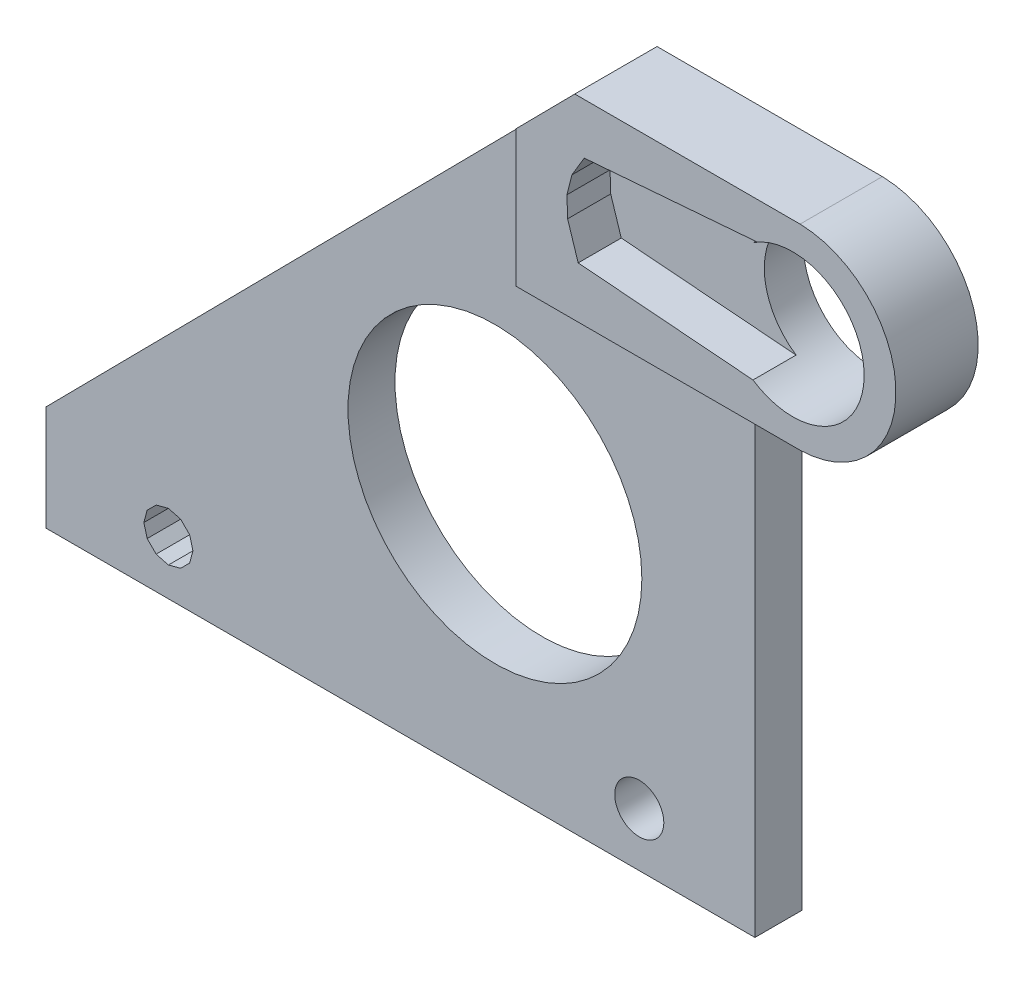
ISO-10303-21;
HEADER;
FILE_DESCRIPTION(('STEP AP214'),'2;1');
FILE_NAME('part.step','',(''),(''),'','','');
FILE_SCHEMA(('AUTOMOTIVE_DESIGN { 1 0 10303 214 1 1 1 1 }'));
ENDSEC;
DATA;
#1=APPLICATION_CONTEXT('core data for automotive mechanical design processes');
#2=APPLICATION_PROTOCOL_DEFINITION('international standard','automotive_design',2000,#1);
#3=PRODUCT_CONTEXT('',#1,'mechanical');
#4=PRODUCT('Part','Part','',(#3));
#5=PRODUCT_RELATED_PRODUCT_CATEGORY('part','',(#4));
#6=PRODUCT_DEFINITION_FORMATION('','',#4);
#7=PRODUCT_DEFINITION_CONTEXT('part definition',#1,'design');
#8=PRODUCT_DEFINITION('design','',#6,#7);
#9=PRODUCT_DEFINITION_SHAPE('','',#8);
#10=(LENGTH_UNIT() NAMED_UNIT(*) SI_UNIT(.MILLI.,.METRE.));
#11=(NAMED_UNIT(*) PLANE_ANGLE_UNIT() SI_UNIT($,.RADIAN.));
#12=(NAMED_UNIT(*) SI_UNIT($,.STERADIAN.) SOLID_ANGLE_UNIT());
#13=UNCERTAINTY_MEASURE_WITH_UNIT(LENGTH_MEASURE(1.E-05),#10,'distance_accuracy_value','');
#14=(GEOMETRIC_REPRESENTATION_CONTEXT(3) GLOBAL_UNCERTAINTY_ASSIGNED_CONTEXT((#13)) GLOBAL_UNIT_ASSIGNED_CONTEXT((#10,
#11,#12)) REPRESENTATION_CONTEXT('',''));
#15=CARTESIAN_POINT('',(0.,0.,0.));
#16=DIRECTION('',(0.,0.,1.));
#17=DIRECTION('',(1.,0.,0.));
#18=AXIS2_PLACEMENT_3D('',#15,#16,#17);
#19=CARTESIAN_POINT('',(0.,0.,2.40000011399388));
#20=DIRECTION('',(0.,0.,1.));
#21=DIRECTION('',(1.,0.,0.));
#22=AXIS2_PLACEMENT_3D('',#19,#20,#21);
#23=PLANE('',#22);
#24=DIRECTION('',(-0.966208690354707,0.257761065103018,0.));
#25=VECTOR('',#24,1.);
#26=CARTESIAN_POINT('',(-3.98662066640118,-14.9437135957094,2.40000011399388));
#27=LINE('',#26,#25);
#28=CARTESIAN_POINT('',(38.0759984254837,-26.1650010943413,2.40000011399388));
#29=VERTEX_POINT('',#28);
#30=CARTESIAN_POINT('',(37.4500006437302,-25.9980000555515,2.40000011399388));
#31=VERTEX_POINT('',#30);
#32=EDGE_CURVE('E359',#29,#31,#27,.T.);
#33=ORIENTED_EDGE('',*,*,#32,.F.);
#34=DIRECTION('',(-0.70710821592403,0.707105346446154,0.));
#35=VECTOR('',#34,1.);
#36=CARTESIAN_POINT('',(5.95542140844002,5.95544557591387,2.40000011399388));
#37=LINE('',#36,#35);
#38=CARTESIAN_POINT('',(38.5349988937378,-26.6239996999502,2.40000011399388));
#39=VERTEX_POINT('',#38);
#40=EDGE_CURVE('E299',#39,#29,#37,.T.);
#41=ORIENTED_EDGE('',*,*,#40,.F.);
#42=DIRECTION('',(-0.25919807048093,0.965824187033522,0.));
#43=VECTOR('',#42,1.);
#44=CARTESIAN_POINT('',(29.28103156368,7.85814539011296,2.40000011399388));
#45=LINE('',#44,#43);
#46=CARTESIAN_POINT('',(38.7029983103275,-27.2499993443489,2.40000011399388));
#47=VERTEX_POINT('',#46);
#48=EDGE_CURVE('E239',#47,#39,#45,.T.);
#49=ORIENTED_EDGE('',*,*,#48,.F.);
#50=DIRECTION('',(0.25919807048093,0.965824187033522,0.));
#51=VECTOR('',#50,1.);
#52=CARTESIAN_POINT('',(42.924548466217,-11.5196536679014,2.40000011399388));
#53=LINE('',#52,#51);
#54=CARTESIAN_POINT('',(38.5349988937378,-27.8759989887476,2.40000011399388));
#55=VERTEX_POINT('',#54);
#56=EDGE_CURVE('E332',#55,#47,#53,.T.);
#57=ORIENTED_EDGE('',*,*,#56,.F.);
#58=DIRECTION('',(0.707106781186548,0.707106781186548,0.));
#59=VECTOR('',#58,1.);
#60=CARTESIAN_POINT('',(33.2054989412427,-33.2054989412427,2.40000011399388));
#61=LINE('',#60,#59);
#62=CARTESIAN_POINT('',(38.0759984254837,-28.3349994570017,2.40000011399388));
#63=VERTEX_POINT('',#62);
#64=EDGE_CURVE('E335',#63,#55,#61,.T.);
#65=ORIENTED_EDGE('',*,*,#64,.F.);
#66=DIRECTION('',(0.965823274532014,0.259201470621325,0.));
#67=VECTOR('',#66,1.);
#68=CARTESIAN_POINT('',(9.65161474873277,-35.9633536754156,2.40000011399388));
#69=LINE('',#68,#67);
#70=CARTESIAN_POINT('',(37.4500006437302,-28.5030007362366,2.40000011399388));
#71=VERTEX_POINT('',#70);
#72=EDGE_CURVE('E338',#71,#63,#69,.T.);
#73=ORIENTED_EDGE('',*,*,#72,.F.);
#74=DIRECTION('',(0.965823274532014,-0.259201470621325,0.));
#75=VECTOR('',#74,1.);
#76=CARTESIAN_POINT('',(-4.61942802455213,-17.2126766504959,2.40000011399388));
#77=LINE('',#76,#75);
#78=CARTESIAN_POINT('',(36.8240028619766,-28.3349994570017,2.40000011399388));
#79=VERTEX_POINT('',#78);
#80=EDGE_CURVE('E341',#79,#71,#77,.T.);
#81=ORIENTED_EDGE('',*,*,#80,.F.);
#82=DIRECTION('',(0.707106781186548,-0.707106781186548,0.));
#83=VECTOR('',#82,1.);
#84=CARTESIAN_POINT('',(4.24450170248747,4.24450170248747,2.40000011399388));
#85=LINE('',#84,#83);
#86=CARTESIAN_POINT('',(36.3650023937225,-27.8759989887476,2.40000011399388));
#87=VERTEX_POINT('',#86);
#88=EDGE_CURVE('E344',#87,#79,#85,.T.);
#89=ORIENTED_EDGE('',*,*,#88,.F.);
#90=DIRECTION('',(0.257760349099157,-0.966208881366902,0.));
#91=VECTOR('',#90,1.);
#92=CARTESIAN_POINT('',(27.0063701911797,7.20462370262167,2.40000011399388));
#93=LINE('',#92,#91);
#94=CARTESIAN_POINT('',(36.1980013549328,-27.2499993443489,2.40000011399388));
#95=VERTEX_POINT('',#94);
#96=EDGE_CURVE('E347',#95,#87,#93,.T.);
#97=ORIENTED_EDGE('',*,*,#96,.F.);
#98=DIRECTION('',(-0.257760349099157,-0.966208881366902,0.));
#99=VECTOR('',#98,1.);
#100=CARTESIAN_POINT('',(40.5796133163287,-10.8256252829389,2.40000011399388));
#101=LINE('',#100,#99);
#102=CARTESIAN_POINT('',(36.3650023937225,-26.6239996999502,2.40000011399388));
#103=VERTEX_POINT('',#102);
#104=EDGE_CURVE('E350',#103,#95,#101,.T.);
#105=ORIENTED_EDGE('',*,*,#104,.F.);
#106=DIRECTION('',(-0.70710821592403,-0.707105346446154,0.));
#107=VECTOR('',#106,1.);
#108=CARTESIAN_POINT('',(31.4944272611455,-31.4945550675079,2.40000011399388));
#109=LINE('',#108,#107);
#110=CARTESIAN_POINT('',(36.8240028619766,-26.1650010943413,2.40000011399388));
#111=VERTEX_POINT('',#110);
#112=EDGE_CURVE('E353',#111,#103,#109,.T.);
#113=ORIENTED_EDGE('',*,*,#112,.F.);
#114=DIRECTION('',(-0.966208690354707,-0.257761065103018,0.));
#115=VECTOR('',#114,1.);
#116=CARTESIAN_POINT('',(8.9630341765009,-33.5976324035605,2.40000011399388));
#117=LINE('',#116,#115);
#118=EDGE_CURVE('E356',#31,#111,#117,.T.);
#119=ORIENTED_EDGE('',*,*,#118,.F.);
#120=EDGE_LOOP('',(#33,#41,#49,#57,#65,#73,#81,#89,#97,#105,#113,#119));
#121=FACE_BOUND('',#120,.T.);
#122=CARTESIAN_POINT('',(61.4942992281784,-27.2510253985397,2.40000011399388));
#123=DIRECTION('',(0.,0.,1.));
#124=DIRECTION('',(1.,0.,0.));
#125=AXIS2_PLACEMENT_3D('',#122,#123,#124);
#126=CIRCLE('',#125,1.2527587925465);
#127=CARTESIAN_POINT('',(62.7470580207249,-27.2510253985397,2.40000011399388));
#128=VERTEX_POINT('',#127);
#129=EDGE_CURVE('E362',#128,#128,#126,.T.);
#130=ORIENTED_EDGE('',*,*,#129,.F.);
#131=EDGE_LOOP('',(#130));
#132=FACE_BOUND('',#131,.T.);
#133=CARTESIAN_POINT('',(54.1229288053763,-17.0282926595011,2.40000011399388));
#134=DIRECTION('',(0.,0.,1.));
#135=DIRECTION('',(1.,0.,0.));
#136=AXIS2_PLACEMENT_3D('',#133,#134,#135);
#137=CIRCLE('',#136,7.50265038955251);
#138=CARTESIAN_POINT('',(61.6255791949288,-17.0282926595011,2.40000011399388));
#139=VERTEX_POINT('',#138);
#140=EDGE_CURVE('E367',#139,#139,#137,.T.);
#141=ORIENTED_EDGE('',*,*,#140,.F.);
#142=EDGE_LOOP('',(#141));
#143=FACE_BOUND('',#142,.T.);
#144=DIRECTION('',(-0.703007968621737,-0.711181971125772,0.));
#145=VECTOR('',#144,1.);
#146=CARTESIAN_POINT('',(46.9241922356063,-8.72940394256119,2.40000011399388));
#147=LINE('',#146,#145);
#148=CARTESIAN_POINT('',(46.9241922356063,-8.72940394256119,2.40000011399388));
#149=VERTEX_POINT('',#148);
#150=CARTESIAN_POINT('',(31.2000010162592,-24.63642321527,2.40000011399388));
#151=VERTEX_POINT('',#150);
#152=EDGE_CURVE('E434',#149,#151,#147,.T.);
#153=ORIENTED_EDGE('',*,*,#152,.T.);
#154=DIRECTION('',(0.,1.,0.));
#155=VECTOR('',#154,1.);
#156=CARTESIAN_POINT('',(31.2000010162592,-29.9999993294477,2.40000011399388));
#157=LINE('',#156,#155);
#158=CARTESIAN_POINT('',(31.2000010162592,-29.9999993294477,2.40000011399388));
#159=VERTEX_POINT('',#158);
#160=EDGE_CURVE('E392',#159,#151,#157,.T.);
#161=ORIENTED_EDGE('',*,*,#160,.F.);
#162=DIRECTION('',(-1.,0.,0.));
#163=VECTOR('',#162,1.);
#164=CARTESIAN_POINT('',(31.2000010162592,-29.9999993294477,2.40000011399388));
#165=LINE('',#164,#163);
#166=CARTESIAN_POINT('',(67.4000009894371,-29.9999993294477,2.40000011399388));
#167=VERTEX_POINT('',#166);
#168=EDGE_CURVE('E390',#167,#159,#165,.T.);
#169=ORIENTED_EDGE('',*,*,#168,.F.);
#170=DIRECTION('',(0.,-1.,0.));
#171=VECTOR('',#170,1.);
#172=CARTESIAN_POINT('',(67.4000021519565,-5.49999997019768,2.40000011399388));
#173=LINE('',#172,#171);
#174=CARTESIAN_POINT('',(67.4000021519565,-5.49999997019768,2.40000011399388));
#175=VERTEX_POINT('',#174);
#176=EDGE_CURVE('E401',#175,#167,#173,.T.);
#177=ORIENTED_EDGE('',*,*,#176,.F.);
#178=DIRECTION('',(-1.,0.,0.));
#179=VECTOR('',#178,1.);
#180=CARTESIAN_POINT('',(71.5056136250496,-5.49999997019768,2.40000011399388));
#181=LINE('',#180,#179);
#182=CARTESIAN_POINT('',(57.0000000298023,-5.49999997019768,2.40000011399388));
#183=VERTEX_POINT('',#182);
#184=EDGE_CURVE('E412',#175,#183,#181,.T.);
#185=ORIENTED_EDGE('',*,*,#184,.T.);
#186=DIRECTION('',(0.,1.,0.));
#187=VECTOR('',#186,1.);
#188=CARTESIAN_POINT('',(57.0000000298023,-7.40568592017014,2.40000011399388));
#189=LINE('',#188,#187);
#190=CARTESIAN_POINT('',(57.0000000298023,1.4635578263551,2.40000011399388));
#191=VERTEX_POINT('',#190);
#192=EDGE_CURVE('E422',#183,#191,#189,.T.);
#193=ORIENTED_EDGE('',*,*,#192,.T.);
#194=DIRECTION('',(-0.70300801596017,-0.711181924331422,0.));
#195=VECTOR('',#194,1.);
#196=CARTESIAN_POINT('',(57.0000000298023,1.4635578263551,2.40000011399388));
#197=LINE('',#196,#195);
#198=EDGE_CURVE('E425',#191,#149,#197,.T.);
#199=ORIENTED_EDGE('',*,*,#198,.T.);
#200=EDGE_LOOP('',(#153,#161,#169,#177,#185,#193,#199));
#201=FACE_BOUND('',#200,.T.);
#202=ADVANCED_FACE('F38',(#121,#132,#143,#201),#23,.T.);
#203=CARTESIAN_POINT('',(71.505614787569,4.49999865712685,0.));
#204=DIRECTION('',(0.,1.,0.));
#205=DIRECTION('',(-1.,0.,0.));
#206=AXIS2_PLACEMENT_3D('',#203,#204,#205);
#207=PLANE('',#206);
#208=DIRECTION('',(-1.,0.,0.));
#209=VECTOR('',#208,1.);
#210=CARTESIAN_POINT('',(71.505614787569,4.49999865712685,4.19999985024333));
#211=LINE('',#210,#209);
#212=CARTESIAN_POINT('',(71.505614787569,4.49999865712685,4.19999985024333));
#213=VERTEX_POINT('',#212);
#214=CARTESIAN_POINT('',(60.0015420915985,4.49999865712685,4.19999985024333));
#215=VERTEX_POINT('',#214);
#216=EDGE_CURVE('E513',#213,#215,#211,.T.);
#217=ORIENTED_EDGE('',*,*,#216,.F.);
#218=DIRECTION('',(0.,0.,1.));
#219=VECTOR('',#218,1.);
#220=CARTESIAN_POINT('',(71.505614787569,4.49999865712685,0.));
#221=LINE('',#220,#219);
#222=CARTESIAN_POINT('',(71.505614787569,4.49999865712685,0.));
#223=VERTEX_POINT('',#222);
#224=EDGE_CURVE('E541',#223,#213,#221,.T.);
#225=ORIENTED_EDGE('',*,*,#224,.F.);
#226=DIRECTION('',(-1.,0.,0.));
#227=VECTOR('',#226,1.);
#228=CARTESIAN_POINT('',(71.505614787569,4.49999865712685,0.));
#229=LINE('',#228,#227);
#230=CARTESIAN_POINT('',(60.0015420915985,4.49999865712685,0.));
#231=VERTEX_POINT('',#230);
#232=EDGE_CURVE('E517',#223,#231,#229,.T.);
#233=ORIENTED_EDGE('',*,*,#232,.T.);
#234=DIRECTION('',(0.,0.,1.));
#235=VECTOR('',#234,1.);
#236=CARTESIAN_POINT('',(60.0015420915985,4.49999865712685,0.));
#237=LINE('',#236,#235);
#238=EDGE_CURVE('E530',#231,#215,#237,.T.);
#239=ORIENTED_EDGE('',*,*,#238,.T.);
#240=EDGE_LOOP('',(#217,#225,#233,#239));
#241=FACE_BOUND('',#240,.T.);
#242=ADVANCED_FACE('F40',(#241),#207,.T.);
#243=CARTESIAN_POINT('',(71.3988662053926,-0.500001231114437,0.));
#244=DIRECTION('',(0.,0.,1.));
#245=DIRECTION('',(1.,0.,0.));
#246=AXIS2_PLACEMENT_3D('',#243,#244,#245);
#247=CYLINDRICAL_SURFACE('',#246,5.00113928442406);
#248=CARTESIAN_POINT('',(71.3988662053926,-0.500001231114437,4.19999985024333));
#249=DIRECTION('',(0.,0.,1.));
#250=DIRECTION('',(-1.,0.,0.));
#251=AXIS2_PLACEMENT_3D('',#248,#249,#250);
#252=CIRCLE('',#251,5.00113928442406);
#253=CARTESIAN_POINT('',(71.5056136250496,-5.49999997019768,4.19999985024333));
#254=VERTEX_POINT('',#253);
#255=EDGE_CURVE('E522',#254,#213,#252,.T.);
#256=ORIENTED_EDGE('',*,*,#255,.F.);
#257=DIRECTION('',(0.,0.,1.));
#258=VECTOR('',#257,1.);
#259=CARTESIAN_POINT('',(71.505614787569,-5.50000111935573,0.));
#260=LINE('',#259,#258);
#261=CARTESIAN_POINT('',(71.505614787569,-5.49999997019768,0.));
#262=VERTEX_POINT('',#261);
#263=EDGE_CURVE('E545',#262,#254,#260,.T.);
#264=ORIENTED_EDGE('',*,*,#263,.F.);
#265=CARTESIAN_POINT('',(71.3988662053926,-0.500001231114437,0.));
#266=DIRECTION('',(0.,0.,1.));
#267=DIRECTION('',(-1.,0.,0.));
#268=AXIS2_PLACEMENT_3D('',#265,#266,#267);
#269=CIRCLE('',#268,5.00113928442406);
#270=EDGE_CURVE('E526',#262,#223,#269,.T.);
#271=ORIENTED_EDGE('',*,*,#270,.T.);
#272=ORIENTED_EDGE('',*,*,#224,.T.);
#273=EDGE_LOOP('',(#256,#264,#271,#272));
#274=FACE_BOUND('',#273,.T.);
#275=ADVANCED_FACE('F613',(#274),#247,.T.);
#276=CARTESIAN_POINT('',(36.1980013549327,-19.5803102105856,0.));
#277=DIRECTION('',(-0.711181971125772,0.703007968621737,0.));
#278=DIRECTION('',(-0.703007968621737,-0.711181971125772,0.));
#279=AXIS2_PLACEMENT_3D('',#276,#277,#278);
#280=PLANE('',#279);
#281=DIRECTION('',(0.,0.,1.));
#282=VECTOR('',#281,1.);
#283=CARTESIAN_POINT('',(57.0000000298023,1.4635578263551,2.40000011399388));
#284=LINE('',#283,#282);
#285=CARTESIAN_POINT('',(57.0000000298023,1.4635578263551,4.19999985024333));
#286=VERTEX_POINT('',#285);
#287=EDGE_CURVE('E428',#191,#286,#284,.T.);
#288=ORIENTED_EDGE('',*,*,#287,.T.);
#289=DIRECTION('',(-0.703007968621737,-0.711181971125772,0.));
#290=VECTOR('',#289,1.);
#291=CARTESIAN_POINT('',(36.1980013549327,-19.5803102105856,4.19999985024333));
#292=LINE('',#291,#290);
#293=EDGE_CURVE('E534',#215,#286,#292,.T.);
#294=ORIENTED_EDGE('',*,*,#293,.F.);
#295=ORIENTED_EDGE('',*,*,#238,.F.);
#296=DIRECTION('',(-0.703007968621737,-0.711181971125772,0.));
#297=VECTOR('',#296,1.);
#298=CARTESIAN_POINT('',(60.0015420915985,4.49999865712685,0.));
#299=LINE('',#298,#297);
#300=CARTESIAN_POINT('',(31.2000010162592,-24.63642321527,0.));
#301=VERTEX_POINT('',#300);
#302=EDGE_CURVE('E521',#231,#301,#299,.T.);
#303=ORIENTED_EDGE('',*,*,#302,.T.);
#304=DIRECTION('',(0.,0.,1.));
#305=VECTOR('',#304,1.);
#306=CARTESIAN_POINT('',(31.2000010162592,-24.63642321527,0.));
#307=LINE('',#306,#305);
#308=EDGE_CURVE('E548',#301,#151,#307,.T.);
#309=ORIENTED_EDGE('',*,*,#308,.T.);
#310=ORIENTED_EDGE('',*,*,#152,.F.);
#311=ORIENTED_EDGE('',*,*,#198,.F.);
#312=EDGE_LOOP('',(#288,#294,#295,#303,#309,#310,#311));
#313=FACE_BOUND('',#312,.T.);
#314=ADVANCED_FACE('F638',(#313),#280,.T.);
#315=CARTESIAN_POINT('',(71.3988662053926,-0.500001231114437,0.));
#316=DIRECTION('',(0.,0.,-1.));
#317=DIRECTION('',(-1.,0.,0.));
#318=AXIS2_PLACEMENT_3D('',#315,#316,#317);
#319=PLANE('',#318);
#320=DIRECTION('',(0.966208690354707,-0.257761065103018,0.));
#321=VECTOR('',#320,1.);
#322=CARTESIAN_POINT('',(37.4500006437302,-25.9980000555515,0.));
#323=LINE('',#322,#321);
#324=CARTESIAN_POINT('',(37.4500006437302,-25.9980000555515,0.));
#325=VERTEX_POINT('',#324);
#326=CARTESIAN_POINT('',(38.0759984254837,-26.1650010943413,0.));
#327=VERTEX_POINT('',#326);
#328=EDGE_CURVE('E62',#325,#327,#323,.T.);
#329=ORIENTED_EDGE('',*,*,#328,.F.);
#330=DIRECTION('',(0.966208690354707,0.257761065103018,0.));
#331=VECTOR('',#330,1.);
#332=CARTESIAN_POINT('',(36.8240028619766,-26.1650010943413,0.));
#333=LINE('',#332,#331);
#334=CARTESIAN_POINT('',(36.8240028619766,-26.1650010943413,0.));
#335=VERTEX_POINT('',#334);
#336=EDGE_CURVE('E292',#335,#325,#333,.T.);
#337=ORIENTED_EDGE('',*,*,#336,.F.);
#338=DIRECTION('',(0.70710821592403,0.707105346446154,0.));
#339=VECTOR('',#338,1.);
#340=CARTESIAN_POINT('',(36.3650023937225,-26.6239996999502,0.));
#341=LINE('',#340,#339);
#342=CARTESIAN_POINT('',(36.3650023937225,-26.6239996999502,0.));
#343=VERTEX_POINT('',#342);
#344=EDGE_CURVE('E288',#343,#335,#341,.T.);
#345=ORIENTED_EDGE('',*,*,#344,.F.);
#346=DIRECTION('',(0.257760349099157,0.966208881366902,0.));
#347=VECTOR('',#346,1.);
#348=CARTESIAN_POINT('',(36.1980013549328,-27.2499993443489,0.));
#349=LINE('',#348,#347);
#350=CARTESIAN_POINT('',(36.1980013549328,-27.2499993443489,0.));
#351=VERTEX_POINT('',#350);
#352=EDGE_CURVE('E284',#351,#343,#349,.T.);
#353=ORIENTED_EDGE('',*,*,#352,.F.);
#354=DIRECTION('',(-0.257760349099157,0.966208881366902,0.));
#355=VECTOR('',#354,1.);
#356=CARTESIAN_POINT('',(36.3650023937225,-27.8759989887476,0.));
#357=LINE('',#356,#355);
#358=CARTESIAN_POINT('',(36.3650023937225,-27.8759989887476,0.));
#359=VERTEX_POINT('',#358);
#360=EDGE_CURVE('E280',#359,#351,#357,.T.);
#361=ORIENTED_EDGE('',*,*,#360,.F.);
#362=DIRECTION('',(-0.707106781186547,0.707106781186547,0.));
#363=VECTOR('',#362,1.);
#364=CARTESIAN_POINT('',(36.8240028619766,-28.3349994570017,0.));
#365=LINE('',#364,#363);
#366=CARTESIAN_POINT('',(36.8240028619766,-28.3349994570017,0.));
#367=VERTEX_POINT('',#366);
#368=EDGE_CURVE('E276',#367,#359,#365,.T.);
#369=ORIENTED_EDGE('',*,*,#368,.F.);
#370=DIRECTION('',(-0.965823274532014,0.259201470621325,0.));
#371=VECTOR('',#370,1.);
#372=CARTESIAN_POINT('',(37.4500006437302,-28.5030007362366,0.));
#373=LINE('',#372,#371);
#374=CARTESIAN_POINT('',(37.4500006437302,-28.5030007362366,0.));
#375=VERTEX_POINT('',#374);
#376=EDGE_CURVE('E272',#375,#367,#373,.T.);
#377=ORIENTED_EDGE('',*,*,#376,.F.);
#378=DIRECTION('',(-0.965823274532014,-0.259201470621325,0.));
#379=VECTOR('',#378,1.);
#380=CARTESIAN_POINT('',(38.0759984254837,-28.3349994570017,0.));
#381=LINE('',#380,#379);
#382=CARTESIAN_POINT('',(38.0759984254837,-28.3349994570017,0.));
#383=VERTEX_POINT('',#382);
#384=EDGE_CURVE('E268',#383,#375,#381,.T.);
#385=ORIENTED_EDGE('',*,*,#384,.F.);
#386=DIRECTION('',(-0.707106781186547,-0.707106781186547,0.));
#387=VECTOR('',#386,1.);
#388=CARTESIAN_POINT('',(38.5349988937378,-27.8759989887476,0.));
#389=LINE('',#388,#387);
#390=CARTESIAN_POINT('',(38.5349988937378,-27.8759989887476,0.));
#391=VERTEX_POINT('',#390);
#392=EDGE_CURVE('E261',#391,#383,#389,.T.);
#393=ORIENTED_EDGE('',*,*,#392,.F.);
#394=DIRECTION('',(-0.25919807048093,-0.965824187033522,0.));
#395=VECTOR('',#394,1.);
#396=CARTESIAN_POINT('',(38.7029983103275,-27.2499993443489,0.));
#397=LINE('',#396,#395);
#398=CARTESIAN_POINT('',(38.7029983103275,-27.2499993443489,0.));
#399=VERTEX_POINT('',#398);
#400=EDGE_CURVE('E255',#399,#391,#397,.T.);
#401=ORIENTED_EDGE('',*,*,#400,.F.);
#402=DIRECTION('',(0.25919807048093,-0.965824187033522,0.));
#403=VECTOR('',#402,1.);
#404=CARTESIAN_POINT('',(38.5349988937378,-26.6239996999502,0.));
#405=LINE('',#404,#403);
#406=CARTESIAN_POINT('',(38.5349988937378,-26.6239996999502,0.));
#407=VERTEX_POINT('',#406);
#408=EDGE_CURVE('E236',#407,#399,#405,.T.);
#409=ORIENTED_EDGE('',*,*,#408,.F.);
#410=DIRECTION('',(0.70710821592403,-0.707105346446154,0.));
#411=VECTOR('',#410,1.);
#412=CARTESIAN_POINT('',(38.0759984254837,-26.1650010943413,0.));
#413=LINE('',#412,#411);
#414=EDGE_CURVE('E246',#327,#407,#413,.T.);
#415=ORIENTED_EDGE('',*,*,#414,.F.);
#416=EDGE_LOOP('',(#329,#337,#345,#353,#361,#369,#377,#385,#393,#401,#409,#415));
#417=FACE_BOUND('',#416,.T.);
#418=CARTESIAN_POINT('',(61.4942992281784,-27.2510253985397,0.));
#419=DIRECTION('',(0.,0.,1.));
#420=DIRECTION('',(1.,0.,0.));
#421=AXIS2_PLACEMENT_3D('',#418,#419,#420);
#422=CIRCLE('',#421,1.2527587925465);
#423=CARTESIAN_POINT('',(62.7470580207249,-27.2510253985397,0.));
#424=VERTEX_POINT('',#423);
#425=EDGE_CURVE('E363',#424,#424,#422,.T.);
#426=ORIENTED_EDGE('',*,*,#425,.T.);
#427=EDGE_LOOP('',(#426));
#428=FACE_BOUND('',#427,.T.);
#429=CARTESIAN_POINT('',(54.1229288053763,-17.0282926595011,0.));
#430=DIRECTION('',(0.,0.,1.));
#431=DIRECTION('',(1.,0.,0.));
#432=AXIS2_PLACEMENT_3D('',#429,#430,#431);
#433=CIRCLE('',#432,7.50265038955251);
#434=CARTESIAN_POINT('',(61.6255791949288,-17.0282926595011,0.));
#435=VERTEX_POINT('',#434);
#436=EDGE_CURVE('E371',#435,#435,#433,.T.);
#437=ORIENTED_EDGE('',*,*,#436,.T.);
#438=EDGE_LOOP('',(#437));
#439=FACE_BOUND('',#438,.T.);
#440=DIRECTION('',(1.,0.,0.));
#441=VECTOR('',#440,1.);
#442=CARTESIAN_POINT('',(67.4000021519565,-5.49999997019768,0.));
#443=LINE('',#442,#441);
#444=CARTESIAN_POINT('',(67.4000021519565,-5.49999997019768,0.));
#445=VERTEX_POINT('',#444);
#446=EDGE_CURVE('E408',#445,#262,#443,.T.);
#447=ORIENTED_EDGE('',*,*,#446,.F.);
#448=DIRECTION('',(0.,1.,0.));
#449=VECTOR('',#448,1.);
#450=CARTESIAN_POINT('',(67.4000021519565,-24.63642321527,0.));
#451=LINE('',#450,#449);
#452=CARTESIAN_POINT('',(67.4000009894371,-29.9999993294477,0.));
#453=VERTEX_POINT('',#452);
#454=EDGE_CURVE('E404',#453,#445,#451,.T.);
#455=ORIENTED_EDGE('',*,*,#454,.F.);
#456=DIRECTION('',(1.,0.,0.));
#457=VECTOR('',#456,1.);
#458=CARTESIAN_POINT('',(67.4000009894371,-29.9999993294477,0.));
#459=LINE('',#458,#457);
#460=CARTESIAN_POINT('',(31.2000010162592,-29.9999993294477,0.));
#461=VERTEX_POINT('',#460);
#462=EDGE_CURVE('E382',#461,#453,#459,.T.);
#463=ORIENTED_EDGE('',*,*,#462,.F.);
#464=DIRECTION('',(0.,1.,0.));
#465=VECTOR('',#464,1.);
#466=CARTESIAN_POINT('',(31.2000010162592,-29.9999993294477,0.));
#467=LINE('',#466,#465);
#468=EDGE_CURVE('E395',#461,#301,#467,.T.);
#469=ORIENTED_EDGE('',*,*,#468,.T.);
#470=ORIENTED_EDGE('',*,*,#302,.F.);
#471=ORIENTED_EDGE('',*,*,#232,.F.);
#472=ORIENTED_EDGE('',*,*,#270,.F.);
#473=EDGE_LOOP('',(#447,#455,#463,#469,#470,#471,#472));
#474=FACE_BOUND('',#473,.T.);
#475=CARTESIAN_POINT('',(71.1275827646559,-0.558826292403976,0.));
#476=DIRECTION('',(0.,0.,1.));
#477=DIRECTION('',(1.,0.,0.));
#478=AXIS2_PLACEMENT_3D('',#475,#476,#477);
#479=CIRCLE('',#478,3.65);
#480=CARTESIAN_POINT('',(74.7775827646559,-0.558826292403976,0.));
#481=VERTEX_POINT('',#480);
#482=EDGE_CURVE('E509',#481,#481,#479,.T.);
#483=ORIENTED_EDGE('',*,*,#482,.T.);
#484=EDGE_LOOP('',(#483));
#485=FACE_BOUND('',#484,.T.);
#486=ADVANCED_FACE('F251',(#417,#428,#439,#474,#485),#319,.T.);
#487=CARTESIAN_POINT('',(71.3988662053926,-0.500001231114437,4.19999985024333));
#488=DIRECTION('',(0.,0.,-1.));
#489=DIRECTION('',(-1.,0.,0.));
#490=AXIS2_PLACEMENT_3D('',#487,#488,#489);
#491=PLANE('',#490);
#492=DIRECTION('',(-0.996834248780806,-0.0795077383504674,0.));
#493=VECTOR('',#492,1.);
#494=CARTESIAN_POINT('',(69.2962631583214,2.61051091365516,4.19999985024333));
#495=LINE('',#494,#493);
#496=CARTESIAN_POINT('',(69.2962631583214,2.61051091365516,4.19999985024333));
#497=VERTEX_POINT('',#496);
#498=CARTESIAN_POINT('',(60.4840657825903,1.90764794110057,4.19999985024333));
#499=VERTEX_POINT('',#498);
#500=EDGE_CURVE('E484',#497,#499,#495,.T.);
#501=ORIENTED_EDGE('',*,*,#500,.F.);
#502=CARTESIAN_POINT('',(71.3268072082046,-0.499999965541065,4.19999985024333));
#503=DIRECTION('',(0.,0.,-1.));
#504=DIRECTION('',(1.,0.,0.));
#505=AXIS2_PLACEMENT_3D('',#502,#503,#504);
#506=CIRCLE('',#505,3.7146180245234);
#507=CARTESIAN_POINT('',(69.1379682369234,2.50122828734392,4.19999985024333));
#508=VERTEX_POINT('',#507);
#509=EDGE_CURVE('E481',#508,#497,#506,.T.);
#510=ORIENTED_EDGE('',*,*,#509,.F.);
#511=CARTESIAN_POINT('',(71.1275827646559,-0.558826292403976,4.19999985024333));
#512=DIRECTION('',(0.,0.,1.));
#513=DIRECTION('',(1.,0.,0.));
#514=AXIS2_PLACEMENT_3D('',#511,#512,#513);
#515=CIRCLE('',#514,3.65);
#516=CARTESIAN_POINT('',(69.10170163639,-3.59499256817617,4.19999985024333));
#517=VERTEX_POINT('',#516);
#518=EDGE_CURVE('E493',#517,#508,#515,.T.);
#519=ORIENTED_EDGE('',*,*,#518,.F.);
#520=DIRECTION('',(0.996834247567128,-0.0795077535670455,0.));
#521=VECTOR('',#520,1.);
#522=CARTESIAN_POINT('',(60.1737051669473,-2.88289329502985,4.19999985024333));
#523=LINE('',#522,#521);
#524=CARTESIAN_POINT('',(60.1737051669473,-2.88289329502985,4.19999985024333));
#525=VERTEX_POINT('',#524);
#526=EDGE_CURVE('E478',#525,#517,#523,.T.);
#527=ORIENTED_EDGE('',*,*,#526,.F.);
#528=DIRECTION('',(0.305197565633101,-0.952289055870973,0.));
#529=VECTOR('',#528,1.);
#530=CARTESIAN_POINT('',(59.6349984407425,-1.20200007222593,4.19999985024333));
#531=LINE('',#530,#529);
#532=CARTESIAN_POINT('',(59.6349984407425,-1.20200007222593,4.19999985024333));
#533=VERTEX_POINT('',#532);
#534=EDGE_CURVE('E474',#533,#525,#531,.T.);
#535=ORIENTED_EDGE('',*,*,#534,.F.);
#536=DIRECTION('',(0.0314716345242074,-0.999504645422108,0.));
#537=VECTOR('',#536,1.);
#538=CARTESIAN_POINT('',(59.6019998192787,-0.153999993926845,4.19999985024333));
#539=LINE('',#538,#537);
#540=CARTESIAN_POINT('',(59.6019998192787,-0.153999993926845,4.19999985024333));
#541=VERTEX_POINT('',#540);
#542=EDGE_CURVE('E470',#541,#533,#539,.T.);
#543=ORIENTED_EDGE('',*,*,#542,.F.);
#544=DIRECTION('',(-0.244343975007103,-0.96968862109325,0.));
#545=VECTOR('',#544,1.);
#546=CARTESIAN_POINT('',(59.8559975624084,0.853999983519316,4.19999985024333));
#547=LINE('',#546,#545);
#548=CARTESIAN_POINT('',(59.8559975624084,0.853999983519316,4.19999985024333));
#549=VERTEX_POINT('',#548);
#550=EDGE_CURVE('E438',#549,#541,#547,.T.);
#551=ORIENTED_EDGE('',*,*,#550,.F.);
#552=DIRECTION('',(-0.512023604171005,-0.858971378319286,0.));
#553=VECTOR('',#552,1.);
#554=CARTESIAN_POINT('',(60.4840657825903,1.90764794110057,4.19999985024333));
#555=LINE('',#554,#553);
#556=EDGE_CURVE('E444',#499,#549,#555,.T.);
#557=ORIENTED_EDGE('',*,*,#556,.F.);
#558=EDGE_LOOP('',(#501,#510,#519,#527,#535,#543,#551,#557));
#559=FACE_BOUND('',#558,.T.);
#560=DIRECTION('',(0.,1.,0.));
#561=VECTOR('',#560,1.);
#562=CARTESIAN_POINT('',(57.0000000298023,-7.40568592017014,4.19999985024333));
#563=LINE('',#562,#561);
#564=CARTESIAN_POINT('',(57.0000000298023,-5.49999997019768,4.19999985024333));
#565=VERTEX_POINT('',#564);
#566=EDGE_CURVE('E421',#565,#286,#563,.T.);
#567=ORIENTED_EDGE('',*,*,#566,.F.);
#568=DIRECTION('',(-1.,0.,0.));
#569=VECTOR('',#568,1.);
#570=CARTESIAN_POINT('',(71.5056136250496,-5.49999997019768,4.19999985024333));
#571=LINE('',#570,#569);
#572=EDGE_CURVE('E411',#254,#565,#571,.T.);
#573=ORIENTED_EDGE('',*,*,#572,.F.);
#574=ORIENTED_EDGE('',*,*,#255,.T.);
#575=ORIENTED_EDGE('',*,*,#216,.T.);
#576=ORIENTED_EDGE('',*,*,#293,.T.);
#577=EDGE_LOOP('',(#567,#573,#574,#575,#576));
#578=FACE_BOUND('',#577,.T.);
#579=ADVANCED_FACE('F570',(#559,#578),#491,.F.);
#580=CARTESIAN_POINT('',(71.1275827646559,-0.558826292403976,0.));
#581=DIRECTION('',(0.,0.,1.));
#582=DIRECTION('',(1.,0.,0.));
#583=AXIS2_PLACEMENT_3D('',#580,#581,#582);
#584=CYLINDRICAL_SURFACE('',#583,3.65);
#585=ORIENTED_EDGE('',*,*,#518,.T.);
#586=DIRECTION('',(0.,0.,1.));
#587=VECTOR('',#586,1.);
#588=CARTESIAN_POINT('',(69.1379682369234,2.50122828734392,3.09999997261912));
#589=LINE('',#588,#587);
#590=CARTESIAN_POINT('',(69.1379682369234,2.50122828734392,2.0000000949949));
#591=VERTEX_POINT('',#590);
#592=EDGE_CURVE('E11',#508,#591,#589,.F.);
#593=ORIENTED_EDGE('',*,*,#592,.T.);
#594=CARTESIAN_POINT('',(71.1275827646559,-0.558826292403976,2.0000000949949));
#595=DIRECTION('',(0.,0.,1.));
#596=DIRECTION('',(1.,0.,0.));
#597=AXIS2_PLACEMENT_3D('',#594,#595,#596);
#598=CIRCLE('',#597,3.65);
#599=CARTESIAN_POINT('',(69.10170163639,-3.59499256817617,2.0000000949949));
#600=VERTEX_POINT('',#599);
#601=EDGE_CURVE('E544',#600,#591,#598,.F.);
#602=ORIENTED_EDGE('',*,*,#601,.F.);
#603=DIRECTION('',(0.,0.,1.));
#604=VECTOR('',#603,1.);
#605=CARTESIAN_POINT('',(69.10170163639,-3.59499256817617,0.));
#606=LINE('',#605,#604);
#607=EDGE_CURVE('E47',#600,#517,#606,.T.);
#608=ORIENTED_EDGE('',*,*,#607,.T.);
#609=EDGE_LOOP('',(#585,#593,#602,#608));
#610=FACE_BOUND('',#609,.T.);
#611=ORIENTED_EDGE('',*,*,#482,.F.);
#612=EDGE_LOOP('',(#611));
#613=FACE_BOUND('',#612,.T.);
#614=ADVANCED_FACE('F562',(#610,#613),#584,.F.);
#615=CARTESIAN_POINT('',(71.3268072082046,-0.499999965541065,2.0000000949949));
#616=DIRECTION('',(0.,0.,1.));
#617=DIRECTION('',(1.,0.,0.));
#618=AXIS2_PLACEMENT_3D('',#615,#616,#617);
#619=CYLINDRICAL_SURFACE('',#618,3.7146180245234);
#620=ORIENTED_EDGE('',*,*,#509,.T.);
#621=DIRECTION('',(0.,0.,1.));
#622=VECTOR('',#621,1.);
#623=CARTESIAN_POINT('',(69.2962631583214,2.61051091365516,2.0000000949949));
#624=LINE('',#623,#622);
#625=CARTESIAN_POINT('',(69.2962631583214,2.61051091365516,2.0000000949949));
#626=VERTEX_POINT('',#625);
#627=EDGE_CURVE('E497',#626,#497,#624,.T.);
#628=ORIENTED_EDGE('',*,*,#627,.F.);
#629=CARTESIAN_POINT('',(71.3268072082046,-0.499999965541065,2.0000000949949));
#630=DIRECTION('',(0.,0.,-1.));
#631=DIRECTION('',(1.,0.,0.));
#632=AXIS2_PLACEMENT_3D('',#629,#630,#631);
#633=CIRCLE('',#632,3.7146180245234);
#634=EDGE_CURVE('E455',#591,#626,#633,.T.);
#635=ORIENTED_EDGE('',*,*,#634,.F.);
#636=ORIENTED_EDGE('',*,*,#592,.F.);
#637=EDGE_LOOP('',(#620,#628,#635,#636));
#638=FACE_BOUND('',#637,.T.);
#639=ADVANCED_FACE('F576',(#638),#619,.T.);
#640=CARTESIAN_POINT('',(60.1737051669473,-2.88289329502985,2.0000000949949));
#641=DIRECTION('',(-0.0795077535670455,-0.996834247567128,0.));
#642=DIRECTION('',(0.996834247567128,-0.0795077535670455,0.));
#643=AXIS2_PLACEMENT_3D('',#640,#641,#642);
#644=PLANE('',#643);
#645=DIRECTION('',(0.996834247567128,-0.0795077535670455,0.));
#646=VECTOR('',#645,1.);
#647=CARTESIAN_POINT('',(60.1737051669473,-2.88289329502985,2.0000000949949));
#648=LINE('',#647,#646);
#649=CARTESIAN_POINT('',(60.1737051669473,-2.88289329502985,2.0000000949949));
#650=VERTEX_POINT('',#649);
#651=EDGE_CURVE('E452',#650,#600,#648,.T.);
#652=ORIENTED_EDGE('',*,*,#651,.F.);
#653=DIRECTION('',(0.,0.,1.));
#654=VECTOR('',#653,1.);
#655=CARTESIAN_POINT('',(60.1737051669473,-2.88289329502985,2.0000000949949));
#656=LINE('',#655,#654);
#657=EDGE_CURVE('E501',#650,#525,#656,.T.);
#658=ORIENTED_EDGE('',*,*,#657,.T.);
#659=ORIENTED_EDGE('',*,*,#526,.T.);
#660=ORIENTED_EDGE('',*,*,#607,.F.);
#661=EDGE_LOOP('',(#652,#658,#659,#660));
#662=FACE_BOUND('',#661,.T.);
#663=ADVANCED_FACE('F597',(#662),#644,.F.);
#664=CARTESIAN_POINT('',(71.3268072082046,-0.499999965541065,2.0000000949949));
#665=DIRECTION('',(0.,0.,1.));
#666=DIRECTION('',(1.,0.,0.));
#667=AXIS2_PLACEMENT_3D('',#664,#665,#666);
#668=PLANE('',#667);
#669=ORIENTED_EDGE('',*,*,#601,.T.);
#670=ORIENTED_EDGE('',*,*,#634,.T.);
#671=DIRECTION('',(-0.996834248780806,-0.0795077383504674,0.));
#672=VECTOR('',#671,1.);
#673=CARTESIAN_POINT('',(69.2962631583214,2.61051091365516,2.0000000949949));
#674=LINE('',#673,#672);
#675=CARTESIAN_POINT('',(60.4840657825903,1.90764794110057,2.0000000949949));
#676=VERTEX_POINT('',#675);
#677=EDGE_CURVE('E458',#626,#676,#674,.T.);
#678=ORIENTED_EDGE('',*,*,#677,.T.);
#679=DIRECTION('',(-0.512023604171005,-0.858971378319286,0.));
#680=VECTOR('',#679,1.);
#681=CARTESIAN_POINT('',(60.4840657825903,1.90764794110057,2.0000000949949));
#682=LINE('',#681,#680);
#683=CARTESIAN_POINT('',(59.8559975624084,0.853999983519316,2.0000000949949));
#684=VERTEX_POINT('',#683);
#685=EDGE_CURVE('E462',#676,#684,#682,.T.);
#686=ORIENTED_EDGE('',*,*,#685,.T.);
#687=DIRECTION('',(-0.244343975007103,-0.96968862109325,0.));
#688=VECTOR('',#687,1.);
#689=CARTESIAN_POINT('',(59.8559975624084,0.853999983519316,2.0000000949949));
#690=LINE('',#689,#688);
#691=CARTESIAN_POINT('',(59.6019998192787,-0.153999993926845,2.0000000949949));
#692=VERTEX_POINT('',#691);
#693=EDGE_CURVE('E439',#684,#692,#690,.T.);
#694=ORIENTED_EDGE('',*,*,#693,.T.);
#695=DIRECTION('',(0.0314716345242074,-0.999504645422108,0.));
#696=VECTOR('',#695,1.);
#697=CARTESIAN_POINT('',(59.6019998192787,-0.153999993926845,2.0000000949949));
#698=LINE('',#697,#696);
#699=CARTESIAN_POINT('',(59.6349984407425,-1.20200007222593,2.0000000949949));
#700=VERTEX_POINT('',#699);
#701=EDGE_CURVE('E443',#692,#700,#698,.T.);
#702=ORIENTED_EDGE('',*,*,#701,.T.);
#703=DIRECTION('',(0.305197565633101,-0.952289055870973,0.));
#704=VECTOR('',#703,1.);
#705=CARTESIAN_POINT('',(59.6349984407425,-1.20200007222593,2.0000000949949));
#706=LINE('',#705,#704);
#707=EDGE_CURVE('E448',#700,#650,#706,.T.);
#708=ORIENTED_EDGE('',*,*,#707,.T.);
#709=ORIENTED_EDGE('',*,*,#651,.T.);
#710=EDGE_LOOP('',(#669,#670,#678,#686,#694,#702,#708,#709));
#711=FACE_BOUND('',#710,.T.);
#712=ADVANCED_FACE('F583',(#711),#668,.T.);
#713=CARTESIAN_POINT('',(59.8559975624084,0.853999983519316,2.0000000949949));
#714=DIRECTION('',(-0.96968862109325,0.244343975007103,0.));
#715=DIRECTION('',(-0.244343975007103,-0.96968862109325,0.));
#716=AXIS2_PLACEMENT_3D('',#713,#714,#715);
#717=PLANE('',#716);
#718=ORIENTED_EDGE('',*,*,#550,.T.);
#719=DIRECTION('',(0.,0.,1.));
#720=VECTOR('',#719,1.);
#721=CARTESIAN_POINT('',(59.6019998192787,-0.153999993926845,2.0000000949949));
#722=LINE('',#721,#720);
#723=EDGE_CURVE('E466',#692,#541,#722,.T.);
#724=ORIENTED_EDGE('',*,*,#723,.F.);
#725=ORIENTED_EDGE('',*,*,#693,.F.);
#726=DIRECTION('',(0.,0.,1.));
#727=VECTOR('',#726,1.);
#728=CARTESIAN_POINT('',(59.8559975624084,0.853999983519316,2.0000000949949));
#729=LINE('',#728,#727);
#730=EDGE_CURVE('E490',#684,#549,#729,.T.);
#731=ORIENTED_EDGE('',*,*,#730,.T.);
#732=EDGE_LOOP('',(#718,#724,#725,#731));
#733=FACE_BOUND('',#732,.T.);
#734=ADVANCED_FACE('F589',(#733),#717,.F.);
#735=CARTESIAN_POINT('',(60.4840657825903,1.90764794110057,2.0000000949949));
#736=DIRECTION('',(-0.858971378319286,0.512023604171005,0.));
#737=DIRECTION('',(-0.512023604171005,-0.858971378319286,0.));
#738=AXIS2_PLACEMENT_3D('',#735,#736,#737);
#739=PLANE('',#738);
#740=ORIENTED_EDGE('',*,*,#556,.T.);
#741=ORIENTED_EDGE('',*,*,#730,.F.);
#742=ORIENTED_EDGE('',*,*,#685,.F.);
#743=DIRECTION('',(0.,0.,1.));
#744=VECTOR('',#743,1.);
#745=CARTESIAN_POINT('',(60.4840657825903,1.90764794110057,2.0000000949949));
#746=LINE('',#745,#744);
#747=EDGE_CURVE('E494',#676,#499,#746,.T.);
#748=ORIENTED_EDGE('',*,*,#747,.T.);
#749=EDGE_LOOP('',(#740,#741,#742,#748));
#750=FACE_BOUND('',#749,.T.);
#751=ADVANCED_FACE('F585',(#750),#739,.F.);
#752=CARTESIAN_POINT('',(69.2962631583214,2.61051091365516,2.0000000949949));
#753=DIRECTION('',(-0.0795077383504674,0.996834248780806,0.));
#754=DIRECTION('',(-0.996834248780806,-0.0795077383504674,0.));
#755=AXIS2_PLACEMENT_3D('',#752,#753,#754);
#756=PLANE('',#755);
#757=ORIENTED_EDGE('',*,*,#500,.T.);
#758=ORIENTED_EDGE('',*,*,#747,.F.);
#759=ORIENTED_EDGE('',*,*,#677,.F.);
#760=ORIENTED_EDGE('',*,*,#627,.T.);
#761=EDGE_LOOP('',(#757,#758,#759,#760));
#762=FACE_BOUND('',#761,.T.);
#763=ADVANCED_FACE('F580',(#762),#756,.F.);
#764=CARTESIAN_POINT('',(59.6349984407425,-1.20200007222593,2.0000000949949));
#765=DIRECTION('',(-0.952289055870973,-0.305197565633101,0.));
#766=DIRECTION('',(0.305197565633101,-0.952289055870973,0.));
#767=AXIS2_PLACEMENT_3D('',#764,#765,#766);
#768=PLANE('',#767);
#769=ORIENTED_EDGE('',*,*,#534,.T.);
#770=ORIENTED_EDGE('',*,*,#657,.F.);
#771=ORIENTED_EDGE('',*,*,#707,.F.);
#772=DIRECTION('',(0.,0.,1.));
#773=VECTOR('',#772,1.);
#774=CARTESIAN_POINT('',(59.6349984407425,-1.20200007222593,2.0000000949949));
#775=LINE('',#774,#773);
#776=EDGE_CURVE('E504',#700,#533,#775,.T.);
#777=ORIENTED_EDGE('',*,*,#776,.T.);
#778=EDGE_LOOP('',(#769,#770,#771,#777));
#779=FACE_BOUND('',#778,.T.);
#780=ADVANCED_FACE('F596',(#779),#768,.F.);
#781=CARTESIAN_POINT('',(59.6019998192787,-0.153999993926845,2.0000000949949));
#782=DIRECTION('',(-0.999504645422108,-0.0314716345242074,0.));
#783=DIRECTION('',(0.0314716345242074,-0.999504645422109,0.));
#784=AXIS2_PLACEMENT_3D('',#781,#782,#783);
#785=PLANE('',#784);
#786=ORIENTED_EDGE('',*,*,#542,.T.);
#787=ORIENTED_EDGE('',*,*,#776,.F.);
#788=ORIENTED_EDGE('',*,*,#701,.F.);
#789=ORIENTED_EDGE('',*,*,#723,.T.);
#790=EDGE_LOOP('',(#786,#787,#788,#789));
#791=FACE_BOUND('',#790,.T.);
#792=ADVANCED_FACE('F593',(#791),#785,.F.);
#793=CARTESIAN_POINT('',(57.0000000298023,-7.40568592017014,2.40000011399388));
#794=DIRECTION('',(1.,0.,0.));
#795=DIRECTION('',(0.,0.,-1.));
#796=AXIS2_PLACEMENT_3D('',#793,#794,#795);
#797=PLANE('',#796);
#798=ORIENTED_EDGE('',*,*,#192,.F.);
#799=DIRECTION('',(0.,0.,1.));
#800=VECTOR('',#799,1.);
#801=CARTESIAN_POINT('',(57.0000000298023,-5.49999997019768,2.40000011399388));
#802=LINE('',#801,#800);
#803=EDGE_CURVE('E415',#183,#565,#802,.T.);
#804=ORIENTED_EDGE('',*,*,#803,.T.);
#805=ORIENTED_EDGE('',*,*,#566,.T.);
#806=ORIENTED_EDGE('',*,*,#287,.F.);
#807=EDGE_LOOP('',(#798,#804,#805,#806));
#808=FACE_BOUND('',#807,.T.);
#809=ADVANCED_FACE('F618',(#808),#797,.F.);
#810=CARTESIAN_POINT('',(71.5056136250496,-5.49999997019768,2.40000011399388));
#811=DIRECTION('',(0.,1.,0.));
#812=DIRECTION('',(0.,0.,1.));
#813=AXIS2_PLACEMENT_3D('',#810,#811,#812);
#814=PLANE('',#813);
#815=ORIENTED_EDGE('',*,*,#572,.T.);
#816=ORIENTED_EDGE('',*,*,#803,.F.);
#817=ORIENTED_EDGE('',*,*,#184,.F.);
#818=DIRECTION('',(0.,0.,1.));
#819=VECTOR('',#818,1.);
#820=CARTESIAN_POINT('',(67.4000021519565,-5.49999997019768,0.));
#821=LINE('',#820,#819);
#822=EDGE_CURVE('E398',#445,#175,#821,.T.);
#823=ORIENTED_EDGE('',*,*,#822,.F.);
#824=ORIENTED_EDGE('',*,*,#446,.T.);
#825=ORIENTED_EDGE('',*,*,#263,.T.);
#826=EDGE_LOOP('',(#815,#816,#817,#823,#824,#825));
#827=FACE_BOUND('',#826,.T.);
#828=ADVANCED_FACE('F674',(#827),#814,.F.);
#829=CARTESIAN_POINT('',(67.4000021519565,0.,0.));
#830=DIRECTION('',(1.,0.,0.));
#831=DIRECTION('',(0.,0.,-1.));
#832=AXIS2_PLACEMENT_3D('',#829,#830,#831);
#833=PLANE('',#832);
#834=ORIENTED_EDGE('',*,*,#822,.T.);
#835=ORIENTED_EDGE('',*,*,#176,.T.);
#836=DIRECTION('',(0.,0.,1.));
#837=VECTOR('',#836,1.);
#838=CARTESIAN_POINT('',(67.4000009894371,-29.9999993294477,2.40000011399388));
#839=LINE('',#838,#837);
#840=EDGE_CURVE('E386',#453,#167,#839,.T.);
#841=ORIENTED_EDGE('',*,*,#840,.F.);
#842=ORIENTED_EDGE('',*,*,#454,.T.);
#843=EDGE_LOOP('',(#834,#835,#841,#842));
#844=FACE_BOUND('',#843,.T.);
#845=ADVANCED_FACE('F678',(#844),#833,.T.);
#846=CARTESIAN_POINT('',(31.2000010162592,-29.9999993294477,0.));
#847=DIRECTION('',(1.,0.,0.));
#848=DIRECTION('',(0.,0.,-1.));
#849=AXIS2_PLACEMENT_3D('',#846,#847,#848);
#850=PLANE('',#849);
#851=ORIENTED_EDGE('',*,*,#308,.F.);
#852=ORIENTED_EDGE('',*,*,#468,.F.);
#853=DIRECTION('',(0.,0.,-1.));
#854=VECTOR('',#853,1.);
#855=CARTESIAN_POINT('',(31.2000010162592,-29.9999993294477,0.));
#856=LINE('',#855,#854);
#857=EDGE_CURVE('E375',#159,#461,#856,.T.);
#858=ORIENTED_EDGE('',*,*,#857,.F.);
#859=ORIENTED_EDGE('',*,*,#160,.T.);
#860=EDGE_LOOP('',(#851,#852,#858,#859));
#861=FACE_BOUND('',#860,.T.);
#862=ADVANCED_FACE('F666',(#861),#850,.F.);
#863=CARTESIAN_POINT('',(0.,-29.9999993294477,0.));
#864=DIRECTION('',(0.,1.,0.));
#865=DIRECTION('',(0.,0.,1.));
#866=AXIS2_PLACEMENT_3D('',#863,#864,#865);
#867=PLANE('',#866);
#868=ORIENTED_EDGE('',*,*,#857,.T.);
#869=ORIENTED_EDGE('',*,*,#462,.T.);
#870=ORIENTED_EDGE('',*,*,#840,.T.);
#871=ORIENTED_EDGE('',*,*,#168,.T.);
#872=EDGE_LOOP('',(#868,#869,#870,#871));
#873=FACE_BOUND('',#872,.T.);
#874=ADVANCED_FACE('F680',(#873),#867,.F.);
#875=CARTESIAN_POINT('',(54.1229288053763,-17.0282926595011,0.));
#876=DIRECTION('',(0.,0.,1.));
#877=DIRECTION('',(1.,0.,0.));
#878=AXIS2_PLACEMENT_3D('',#875,#876,#877);
#879=CYLINDRICAL_SURFACE('',#878,7.50265038955251);
#880=ORIENTED_EDGE('',*,*,#436,.F.);
#881=EDGE_LOOP('',(#880));
#882=FACE_BOUND('',#881,.T.);
#883=ORIENTED_EDGE('',*,*,#140,.T.);
#884=EDGE_LOOP('',(#883));
#885=FACE_BOUND('',#884,.T.);
#886=ADVANCED_FACE('F682',(#882,#885),#879,.F.);
#887=CARTESIAN_POINT('',(61.4942992281784,-27.2510253985397,0.));
#888=DIRECTION('',(0.,0.,1.));
#889=DIRECTION('',(1.,0.,0.));
#890=AXIS2_PLACEMENT_3D('',#887,#888,#889);
#891=CYLINDRICAL_SURFACE('',#890,1.2527587925465);
#892=ORIENTED_EDGE('',*,*,#425,.F.);
#893=EDGE_LOOP('',(#892));
#894=FACE_BOUND('',#893,.T.);
#895=ORIENTED_EDGE('',*,*,#129,.T.);
#896=EDGE_LOOP('',(#895));
#897=FACE_BOUND('',#896,.T.);
#898=ADVANCED_FACE('F688',(#894,#897),#891,.F.);
#899=CARTESIAN_POINT('',(37.4500006437302,-25.9980000555515,4.19999985024333));
#900=DIRECTION('',(0.257761065103018,0.966208690354707,0.));
#901=DIRECTION('',(-0.966208690354707,0.257761065103018,0.));
#902=AXIS2_PLACEMENT_3D('',#899,#900,#901);
#903=PLANE('',#902);
#904=ORIENTED_EDGE('',*,*,#32,.T.);
#905=DIRECTION('',(0.,0.,-1.));
#906=VECTOR('',#905,1.);
#907=CARTESIAN_POINT('',(37.4500006437302,-25.9980000555515,4.19999985024333));
#908=LINE('',#907,#906);
#909=EDGE_CURVE('E296',#31,#325,#908,.T.);
#910=ORIENTED_EDGE('',*,*,#909,.T.);
#911=ORIENTED_EDGE('',*,*,#328,.T.);
#912=DIRECTION('',(0.,0.,-1.));
#913=VECTOR('',#912,1.);
#914=CARTESIAN_POINT('',(38.0759984254837,-26.1650010943413,4.19999985024333));
#915=LINE('',#914,#913);
#916=EDGE_CURVE('E243',#29,#327,#915,.T.);
#917=ORIENTED_EDGE('',*,*,#916,.F.);
#918=EDGE_LOOP('',(#904,#910,#911,#917));
#919=FACE_BOUND('',#918,.T.);
#920=ADVANCED_FACE('F780',(#919),#903,.F.);
#921=CARTESIAN_POINT('',(36.8240028619766,-26.1650010943413,4.19999985024333));
#922=DIRECTION('',(-0.257761065103018,0.966208690354707,0.));
#923=DIRECTION('',(-0.966208690354707,-0.257761065103018,0.));
#924=AXIS2_PLACEMENT_3D('',#921,#922,#923);
#925=PLANE('',#924);
#926=ORIENTED_EDGE('',*,*,#118,.T.);
#927=DIRECTION('',(0.,0.,-1.));
#928=VECTOR('',#927,1.);
#929=CARTESIAN_POINT('',(36.8240028619766,-26.1650010943413,4.19999985024333));
#930=LINE('',#929,#928);
#931=EDGE_CURVE('E300',#111,#335,#930,.T.);
#932=ORIENTED_EDGE('',*,*,#931,.T.);
#933=ORIENTED_EDGE('',*,*,#336,.T.);
#934=ORIENTED_EDGE('',*,*,#909,.F.);
#935=EDGE_LOOP('',(#926,#932,#933,#934));
#936=FACE_BOUND('',#935,.T.);
#937=ADVANCED_FACE('F872',(#936),#925,.F.);
#938=CARTESIAN_POINT('',(36.3650023937225,-26.6239996999502,4.19999985024333));
#939=DIRECTION('',(-0.707105346446154,0.70710821592403,0.));
#940=DIRECTION('',(-0.70710821592403,-0.707105346446154,0.));
#941=AXIS2_PLACEMENT_3D('',#938,#939,#940);
#942=PLANE('',#941);
#943=ORIENTED_EDGE('',*,*,#112,.T.);
#944=DIRECTION('',(0.,0.,-1.));
#945=VECTOR('',#944,1.);
#946=CARTESIAN_POINT('',(36.3650023937225,-26.6239996999502,4.19999985024333));
#947=LINE('',#946,#945);
#948=EDGE_CURVE('E303',#103,#343,#947,.T.);
#949=ORIENTED_EDGE('',*,*,#948,.T.);
#950=ORIENTED_EDGE('',*,*,#344,.T.);
#951=ORIENTED_EDGE('',*,*,#931,.F.);
#952=EDGE_LOOP('',(#943,#949,#950,#951));
#953=FACE_BOUND('',#952,.T.);
#954=ADVANCED_FACE('F877',(#953),#942,.F.);
#955=CARTESIAN_POINT('',(36.1980013549328,-27.2499993443489,4.19999985024333));
#956=DIRECTION('',(-0.966208881366902,0.257760349099157,0.));
#957=DIRECTION('',(-0.257760349099157,-0.966208881366902,0.));
#958=AXIS2_PLACEMENT_3D('',#955,#956,#957);
#959=PLANE('',#958);
#960=ORIENTED_EDGE('',*,*,#104,.T.);
#961=DIRECTION('',(0.,0.,-1.));
#962=VECTOR('',#961,1.);
#963=CARTESIAN_POINT('',(36.1980013549328,-27.2499993443489,4.19999985024333));
#964=LINE('',#963,#962);
#965=EDGE_CURVE('E306',#95,#351,#964,.T.);
#966=ORIENTED_EDGE('',*,*,#965,.T.);
#967=ORIENTED_EDGE('',*,*,#352,.T.);
#968=ORIENTED_EDGE('',*,*,#948,.F.);
#969=EDGE_LOOP('',(#960,#966,#967,#968));
#970=FACE_BOUND('',#969,.T.);
#971=ADVANCED_FACE('F884',(#970),#959,.F.);
#972=CARTESIAN_POINT('',(36.3650023937225,-27.8759989887476,4.19999985024333));
#973=DIRECTION('',(-0.966208881366902,-0.257760349099157,0.));
#974=DIRECTION('',(0.257760349099157,-0.966208881366902,0.));
#975=AXIS2_PLACEMENT_3D('',#972,#973,#974);
#976=PLANE('',#975);
#977=ORIENTED_EDGE('',*,*,#96,.T.);
#978=DIRECTION('',(0.,0.,-1.));
#979=VECTOR('',#978,1.);
#980=CARTESIAN_POINT('',(36.3650023937225,-27.8759989887476,4.19999985024333));
#981=LINE('',#980,#979);
#982=EDGE_CURVE('E309',#87,#359,#981,.T.);
#983=ORIENTED_EDGE('',*,*,#982,.T.);
#984=ORIENTED_EDGE('',*,*,#360,.T.);
#985=ORIENTED_EDGE('',*,*,#965,.F.);
#986=EDGE_LOOP('',(#977,#983,#984,#985));
#987=FACE_BOUND('',#986,.T.);
#988=ADVANCED_FACE('F891',(#987),#976,.F.);
#989=CARTESIAN_POINT('',(36.8240028619766,-28.3349994570017,4.19999985024333));
#990=DIRECTION('',(-0.707106781186547,-0.707106781186547,0.));
#991=DIRECTION('',(0.707106781186548,-0.707106781186548,0.));
#992=AXIS2_PLACEMENT_3D('',#989,#990,#991);
#993=PLANE('',#992);
#994=ORIENTED_EDGE('',*,*,#88,.T.);
#995=DIRECTION('',(0.,0.,-1.));
#996=VECTOR('',#995,1.);
#997=CARTESIAN_POINT('',(36.8240028619766,-28.3349994570017,4.19999985024333));
#998=LINE('',#997,#996);
#999=EDGE_CURVE('E312',#79,#367,#998,.T.);
#1000=ORIENTED_EDGE('',*,*,#999,.T.);
#1001=ORIENTED_EDGE('',*,*,#368,.T.);
#1002=ORIENTED_EDGE('',*,*,#982,.F.);
#1003=EDGE_LOOP('',(#994,#1000,#1001,#1002));
#1004=FACE_BOUND('',#1003,.T.);
#1005=ADVANCED_FACE('F898',(#1004),#993,.F.);
#1006=CARTESIAN_POINT('',(37.4500006437302,-28.5030007362366,4.19999985024333));
#1007=DIRECTION('',(-0.259201470621325,-0.965823274532014,0.));
#1008=DIRECTION('',(0.965823274532014,-0.259201470621325,0.));
#1009=AXIS2_PLACEMENT_3D('',#1006,#1007,#1008);
#1010=PLANE('',#1009);
#1011=ORIENTED_EDGE('',*,*,#80,.T.);
#1012=DIRECTION('',(0.,0.,-1.));
#1013=VECTOR('',#1012,1.);
#1014=CARTESIAN_POINT('',(37.4500006437302,-28.5030007362366,4.19999985024333));
#1015=LINE('',#1014,#1013);
#1016=EDGE_CURVE('E315',#71,#375,#1015,.T.);
#1017=ORIENTED_EDGE('',*,*,#1016,.T.);
#1018=ORIENTED_EDGE('',*,*,#376,.T.);
#1019=ORIENTED_EDGE('',*,*,#999,.F.);
#1020=EDGE_LOOP('',(#1011,#1017,#1018,#1019));
#1021=FACE_BOUND('',#1020,.T.);
#1022=ADVANCED_FACE('F905',(#1021),#1010,.F.);
#1023=CARTESIAN_POINT('',(38.0759984254837,-28.3349994570017,4.19999985024333));
#1024=DIRECTION('',(0.259201470621325,-0.965823274532014,0.));
#1025=DIRECTION('',(0.965823274532014,0.259201470621325,0.));
#1026=AXIS2_PLACEMENT_3D('',#1023,#1024,#1025);
#1027=PLANE('',#1026);
#1028=ORIENTED_EDGE('',*,*,#72,.T.);
#1029=DIRECTION('',(0.,0.,-1.));
#1030=VECTOR('',#1029,1.);
#1031=CARTESIAN_POINT('',(38.0759984254837,-28.3349994570017,4.19999985024333));
#1032=LINE('',#1031,#1030);
#1033=EDGE_CURVE('E318',#63,#383,#1032,.T.);
#1034=ORIENTED_EDGE('',*,*,#1033,.T.);
#1035=ORIENTED_EDGE('',*,*,#384,.T.);
#1036=ORIENTED_EDGE('',*,*,#1016,.F.);
#1037=EDGE_LOOP('',(#1028,#1034,#1035,#1036));
#1038=FACE_BOUND('',#1037,.T.);
#1039=ADVANCED_FACE('F912',(#1038),#1027,.F.);
#1040=CARTESIAN_POINT('',(38.5349988937378,-27.8759989887476,4.19999985024333));
#1041=DIRECTION('',(0.707106781186547,-0.707106781186547,0.));
#1042=DIRECTION('',(0.707106781186548,0.707106781186548,0.));
#1043=AXIS2_PLACEMENT_3D('',#1040,#1041,#1042);
#1044=PLANE('',#1043);
#1045=ORIENTED_EDGE('',*,*,#64,.T.);
#1046=DIRECTION('',(0.,0.,-1.));
#1047=VECTOR('',#1046,1.);
#1048=CARTESIAN_POINT('',(38.5349988937378,-27.8759989887476,4.19999985024333));
#1049=LINE('',#1048,#1047);
#1050=EDGE_CURVE('E321',#55,#391,#1049,.T.);
#1051=ORIENTED_EDGE('',*,*,#1050,.T.);
#1052=ORIENTED_EDGE('',*,*,#392,.T.);
#1053=ORIENTED_EDGE('',*,*,#1033,.F.);
#1054=EDGE_LOOP('',(#1045,#1051,#1052,#1053));
#1055=FACE_BOUND('',#1054,.T.);
#1056=ADVANCED_FACE('F919',(#1055),#1044,.F.);
#1057=CARTESIAN_POINT('',(38.7029983103275,-27.2499993443489,4.19999985024333));
#1058=DIRECTION('',(0.965824187033522,-0.25919807048093,0.));
#1059=DIRECTION('',(0.25919807048093,0.965824187033522,0.));
#1060=AXIS2_PLACEMENT_3D('',#1057,#1058,#1059);
#1061=PLANE('',#1060);
#1062=ORIENTED_EDGE('',*,*,#56,.T.);
#1063=DIRECTION('',(0.,0.,-1.));
#1064=VECTOR('',#1063,1.);
#1065=CARTESIAN_POINT('',(38.7029983103275,-27.2499993443489,4.19999985024333));
#1066=LINE('',#1065,#1064);
#1067=EDGE_CURVE('E242',#47,#399,#1066,.T.);
#1068=ORIENTED_EDGE('',*,*,#1067,.T.);
#1069=ORIENTED_EDGE('',*,*,#400,.T.);
#1070=ORIENTED_EDGE('',*,*,#1050,.F.);
#1071=EDGE_LOOP('',(#1062,#1068,#1069,#1070));
#1072=FACE_BOUND('',#1071,.T.);
#1073=ADVANCED_FACE('F926',(#1072),#1061,.F.);
#1074=CARTESIAN_POINT('',(38.5349988937378,-26.6239996999502,4.19999985024333));
#1075=DIRECTION('',(0.965824187033522,0.25919807048093,0.));
#1076=DIRECTION('',(-0.25919807048093,0.965824187033522,0.));
#1077=AXIS2_PLACEMENT_3D('',#1074,#1075,#1076);
#1078=PLANE('',#1077);
#1079=ORIENTED_EDGE('',*,*,#48,.T.);
#1080=DIRECTION('',(0.,0.,-1.));
#1081=VECTOR('',#1080,1.);
#1082=CARTESIAN_POINT('',(38.5349988937378,-26.6239996999502,4.19999985024333));
#1083=LINE('',#1082,#1081);
#1084=EDGE_CURVE('E54',#39,#407,#1083,.T.);
#1085=ORIENTED_EDGE('',*,*,#1084,.T.);
#1086=ORIENTED_EDGE('',*,*,#408,.T.);
#1087=ORIENTED_EDGE('',*,*,#1067,.F.);
#1088=EDGE_LOOP('',(#1079,#1085,#1086,#1087));
#1089=FACE_BOUND('',#1088,.T.);
#1090=ADVANCED_FACE('F233',(#1089),#1078,.F.);
#1091=CARTESIAN_POINT('',(38.0759984254837,-26.1650010943413,4.19999985024333));
#1092=DIRECTION('',(0.707105346446154,0.70710821592403,0.));
#1093=DIRECTION('',(-0.70710821592403,0.707105346446154,0.));
#1094=AXIS2_PLACEMENT_3D('',#1091,#1092,#1093);
#1095=PLANE('',#1094);
#1096=ORIENTED_EDGE('',*,*,#40,.T.);
#1097=ORIENTED_EDGE('',*,*,#916,.T.);
#1098=ORIENTED_EDGE('',*,*,#414,.T.);
#1099=ORIENTED_EDGE('',*,*,#1084,.F.);
#1100=EDGE_LOOP('',(#1096,#1097,#1098,#1099));
#1101=FACE_BOUND('',#1100,.T.);
#1102=ADVANCED_FACE('F247',(#1101),#1095,.F.);
#1103=CLOSED_SHELL('',(#202,#242,#275,#314,#486,#579,#614,#639,#663,#712,#734,#751,#763,#780,
#792,#809,#828,#845,#862,#874,#886,#898,#920,#937,#954,#971,#988,#1005,#1022,#1039,#1056,#1073,
#1090,#1102));
#1104=MANIFOLD_SOLID_BREP('B2',#1103);
#1105=ADVANCED_BREP_SHAPE_REPRESENTATION('',(#18,#1104),#14);
#1106=SHAPE_DEFINITION_REPRESENTATION(#9,#1105);
ENDSEC;
END-ISO-10303-21;
